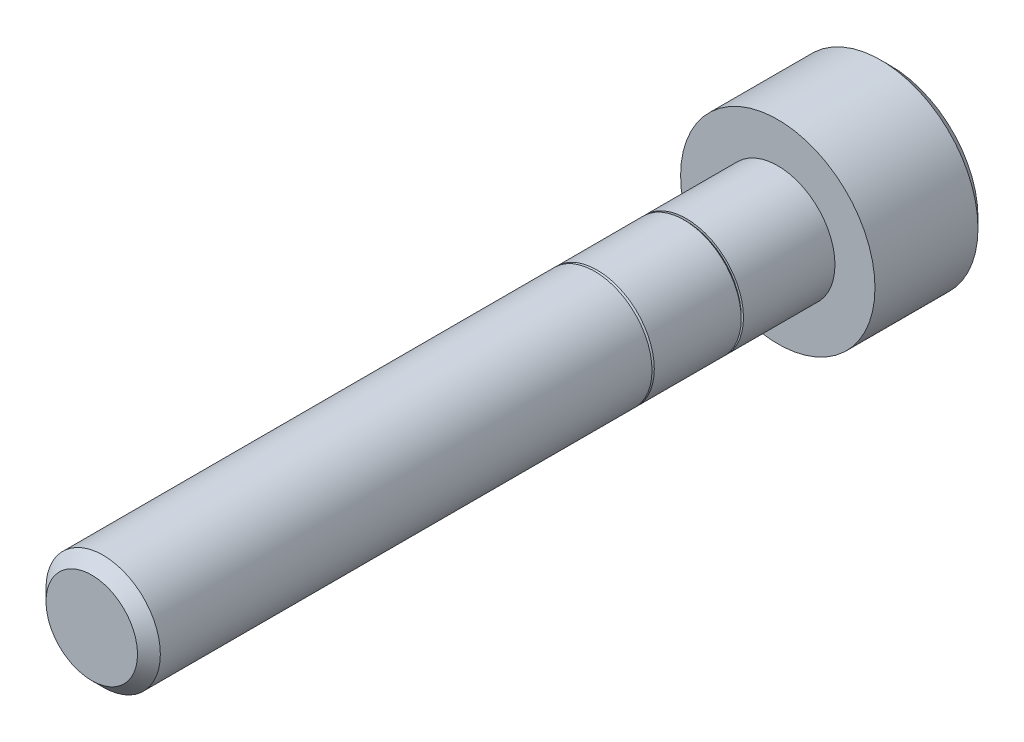
ISO-10303-21;
HEADER;
FILE_DESCRIPTION(('STEP AP214'),'2;1');
FILE_NAME('part.step','',(''),(''),'','','');
FILE_SCHEMA(('AUTOMOTIVE_DESIGN { 1 0 10303 214 1 1 1 1 }'));
ENDSEC;
DATA;
#1=APPLICATION_CONTEXT('core data for automotive mechanical design processes');
#2=APPLICATION_PROTOCOL_DEFINITION('international standard','automotive_design',2000,#1);
#3=PRODUCT_CONTEXT('',#1,'mechanical');
#4=PRODUCT('Part','Part','',(#3));
#5=PRODUCT_RELATED_PRODUCT_CATEGORY('part','',(#4));
#6=PRODUCT_DEFINITION_FORMATION('','',#4);
#7=PRODUCT_DEFINITION_CONTEXT('part definition',#1,'design');
#8=PRODUCT_DEFINITION('design','',#6,#7);
#9=PRODUCT_DEFINITION_SHAPE('','',#8);
#10=(LENGTH_UNIT() NAMED_UNIT(*) SI_UNIT(.MILLI.,.METRE.));
#11=(NAMED_UNIT(*) PLANE_ANGLE_UNIT() SI_UNIT($,.RADIAN.));
#12=(NAMED_UNIT(*) SI_UNIT($,.STERADIAN.) SOLID_ANGLE_UNIT());
#13=UNCERTAINTY_MEASURE_WITH_UNIT(LENGTH_MEASURE(1.E-05),#10,'distance_accuracy_value','');
#14=(GEOMETRIC_REPRESENTATION_CONTEXT(3) GLOBAL_UNCERTAINTY_ASSIGNED_CONTEXT((#13)) GLOBAL_UNIT_ASSIGNED_CONTEXT((#10,
#11,#12)) REPRESENTATION_CONTEXT('',''));
#15=CARTESIAN_POINT('',(0.,0.,0.));
#16=DIRECTION('',(0.,0.,1.));
#17=DIRECTION('',(1.,0.,0.));
#18=AXIS2_PLACEMENT_3D('',#15,#16,#17);
#19=CARTESIAN_POINT('',(0.,0.,-2.43));
#20=DIRECTION('',(0.,0.,1.));
#21=DIRECTION('',(1.,0.,0.));
#22=AXIS2_PLACEMENT_3D('',#19,#20,#21);
#23=PLANE('',#22);
#24=DIRECTION('',(-0.866025403784439,0.5,0.));
#25=VECTOR('',#24,1.);
#26=CARTESIAN_POINT('',(0.,2.3094010767585,-2.43));
#27=LINE('',#26,#25);
#28=CARTESIAN_POINT('',(0.,2.3094010767585,-2.43));
#29=VERTEX_POINT('',#28);
#30=CARTESIAN_POINT('',(2.,1.15470053837925,-2.43));
#31=VERTEX_POINT('',#30);
#32=EDGE_CURVE('E68',#29,#31,#27,.F.);
#33=ORIENTED_EDGE('',*,*,#32,.T.);
#34=DIRECTION('',(0.,1.,0.));
#35=VECTOR('',#34,1.);
#36=CARTESIAN_POINT('',(2.,1.15470053837925,-2.43));
#37=LINE('',#36,#35);
#38=CARTESIAN_POINT('',(2.,-1.15470053837925,-2.43));
#39=VERTEX_POINT('',#38);
#40=EDGE_CURVE('E91',#31,#39,#37,.F.);
#41=ORIENTED_EDGE('',*,*,#40,.T.);
#42=DIRECTION('',(0.866025403784439,0.499999999999999,0.));
#43=VECTOR('',#42,1.);
#44=CARTESIAN_POINT('',(2.,-1.15470053837925,-2.43));
#45=LINE('',#44,#43);
#46=CARTESIAN_POINT('',(0.,-2.3094010767585,-2.43));
#47=VERTEX_POINT('',#46);
#48=EDGE_CURVE('E145',#39,#47,#45,.F.);
#49=ORIENTED_EDGE('',*,*,#48,.T.);
#50=DIRECTION('',(0.866025403784438,-0.5,0.));
#51=VECTOR('',#50,1.);
#52=CARTESIAN_POINT('',(0.,-2.3094010767585,-2.43));
#53=LINE('',#52,#51);
#54=CARTESIAN_POINT('',(-2.,-1.15470053837925,-2.43));
#55=VERTEX_POINT('',#54);
#56=EDGE_CURVE('E140',#47,#55,#53,.F.);
#57=ORIENTED_EDGE('',*,*,#56,.T.);
#58=DIRECTION('',(0.,1.,0.));
#59=VECTOR('',#58,1.);
#60=CARTESIAN_POINT('',(-2.,-1.15470053837925,-2.43));
#61=LINE('',#60,#59);
#62=CARTESIAN_POINT('',(-2.,1.15470053837925,-2.43));
#63=VERTEX_POINT('',#62);
#64=EDGE_CURVE('E74',#55,#63,#61,.T.);
#65=ORIENTED_EDGE('',*,*,#64,.T.);
#66=DIRECTION('',(-0.866025403784439,-0.5,0.));
#67=VECTOR('',#66,1.);
#68=CARTESIAN_POINT('',(-2.,1.15470053837925,-2.43));
#69=LINE('',#68,#67);
#70=EDGE_CURVE('E71',#63,#29,#69,.F.);
#71=ORIENTED_EDGE('',*,*,#70,.T.);
#72=EDGE_LOOP('',(#33,#41,#49,#57,#65,#71));
#73=FACE_BOUND('',#72,.T.);
#74=ADVANCED_FACE('F17',(#73),#23,.F.);
#75=CARTESIAN_POINT('',(-2.,1.15470053837925,-4.93));
#76=DIRECTION('',(-0.5,0.866025403784439,0.));
#77=DIRECTION('',(-0.866025403784439,-0.5,0.));
#78=AXIS2_PLACEMENT_3D('',#75,#76,#77);
#79=PLANE('',#78);
#80=ORIENTED_EDGE('',*,*,#70,.F.);
#81=DIRECTION('',(0.,0.,1.));
#82=VECTOR('',#81,1.);
#83=CARTESIAN_POINT('',(-2.,1.15470053837925,-4.93));
#84=LINE('',#83,#82);
#85=CARTESIAN_POINT('',(-2.,1.15470053837925,-4.93));
#86=VERTEX_POINT('',#85);
#87=EDGE_CURVE('E135',#63,#86,#84,.F.);
#88=ORIENTED_EDGE('',*,*,#87,.T.);
#89=DIRECTION('',(0.866025403784439,0.499999999999999,0.));
#90=VECTOR('',#89,1.);
#91=CARTESIAN_POINT('',(-2.,1.15470053837925,-4.93));
#92=LINE('',#91,#90);
#93=CARTESIAN_POINT('',(0.,2.3094010767585,-4.93));
#94=VERTEX_POINT('',#93);
#95=EDGE_CURVE('E82',#86,#94,#92,.T.);
#96=ORIENTED_EDGE('',*,*,#95,.T.);
#97=DIRECTION('',(0.,0.,1.));
#98=VECTOR('',#97,1.);
#99=CARTESIAN_POINT('',(0.,2.3094010767585,-4.93));
#100=LINE('',#99,#98);
#101=EDGE_CURVE('E77',#94,#29,#100,.T.);
#102=ORIENTED_EDGE('',*,*,#101,.T.);
#103=EDGE_LOOP('',(#80,#88,#96,#102));
#104=FACE_BOUND('',#103,.T.);
#105=ADVANCED_FACE('F80',(#104),#79,.F.);
#106=CARTESIAN_POINT('',(0.,2.3094010767585,-4.93));
#107=DIRECTION('',(0.5,0.866025403784439,0.));
#108=DIRECTION('',(-0.866025403784439,0.5,0.));
#109=AXIS2_PLACEMENT_3D('',#106,#107,#108);
#110=PLANE('',#109);
#111=ORIENTED_EDGE('',*,*,#32,.F.);
#112=ORIENTED_EDGE('',*,*,#101,.F.);
#113=DIRECTION('',(0.866025403784439,-0.5,0.));
#114=VECTOR('',#113,1.);
#115=CARTESIAN_POINT('',(0.,2.3094010767585,-4.93));
#116=LINE('',#115,#114);
#117=CARTESIAN_POINT('',(2.,1.15470053837925,-4.93));
#118=VERTEX_POINT('',#117);
#119=EDGE_CURVE('E132',#94,#118,#116,.T.);
#120=ORIENTED_EDGE('',*,*,#119,.T.);
#121=DIRECTION('',(0.,0.,-1.));
#122=VECTOR('',#121,1.);
#123=CARTESIAN_POINT('',(2.,1.15470053837925,-4.93));
#124=LINE('',#123,#122);
#125=EDGE_CURVE('E88',#118,#31,#124,.F.);
#126=ORIENTED_EDGE('',*,*,#125,.T.);
#127=EDGE_LOOP('',(#111,#112,#120,#126));
#128=FACE_BOUND('',#127,.T.);
#129=ADVANCED_FACE('F86',(#128),#110,.F.);
#130=CARTESIAN_POINT('',(2.,1.15470053837925,-4.93));
#131=DIRECTION('',(1.,0.,0.));
#132=DIRECTION('',(0.,0.,-1.));
#133=AXIS2_PLACEMENT_3D('',#130,#131,#132);
#134=PLANE('',#133);
#135=ORIENTED_EDGE('',*,*,#40,.F.);
#136=ORIENTED_EDGE('',*,*,#125,.F.);
#137=DIRECTION('',(0.,1.,0.));
#138=VECTOR('',#137,1.);
#139=CARTESIAN_POINT('',(2.,0.,-4.93));
#140=LINE('',#139,#138);
#141=CARTESIAN_POINT('',(2.,-1.15470053837925,-4.93));
#142=VERTEX_POINT('',#141);
#143=EDGE_CURVE('E130',#118,#142,#140,.F.);
#144=ORIENTED_EDGE('',*,*,#143,.T.);
#145=DIRECTION('',(0.,0.,1.));
#146=VECTOR('',#145,1.);
#147=CARTESIAN_POINT('',(2.,-1.15470053837925,-4.93));
#148=LINE('',#147,#146);
#149=EDGE_CURVE('E147',#142,#39,#148,.T.);
#150=ORIENTED_EDGE('',*,*,#149,.T.);
#151=EDGE_LOOP('',(#135,#136,#144,#150));
#152=FACE_BOUND('',#151,.T.);
#153=ADVANCED_FACE('F152',(#152),#134,.F.);
#154=CARTESIAN_POINT('',(2.,-1.15470053837925,-4.93));
#155=DIRECTION('',(0.499999999999999,-0.866025403784439,0.));
#156=DIRECTION('',(0.866025403784439,0.499999999999999,0.));
#157=AXIS2_PLACEMENT_3D('',#154,#155,#156);
#158=PLANE('',#157);
#159=ORIENTED_EDGE('',*,*,#48,.F.);
#160=ORIENTED_EDGE('',*,*,#149,.F.);
#161=DIRECTION('',(-0.866025403784439,-0.499999999999999,0.));
#162=VECTOR('',#161,1.);
#163=CARTESIAN_POINT('',(2.,-1.15470053837925,-4.93));
#164=LINE('',#163,#162);
#165=CARTESIAN_POINT('',(0.,-2.3094010767585,-4.93));
#166=VERTEX_POINT('',#165);
#167=EDGE_CURVE('E128',#142,#166,#164,.T.);
#168=ORIENTED_EDGE('',*,*,#167,.T.);
#169=DIRECTION('',(0.,0.,1.));
#170=VECTOR('',#169,1.);
#171=CARTESIAN_POINT('',(0.,-2.3094010767585,-4.93));
#172=LINE('',#171,#170);
#173=EDGE_CURVE('E142',#166,#47,#172,.T.);
#174=ORIENTED_EDGE('',*,*,#173,.T.);
#175=EDGE_LOOP('',(#159,#160,#168,#174));
#176=FACE_BOUND('',#175,.T.);
#177=ADVANCED_FACE('F156',(#176),#158,.F.);
#178=CARTESIAN_POINT('',(0.,-2.3094010767585,-4.93));
#179=DIRECTION('',(-0.5,-0.866025403784438,0.));
#180=DIRECTION('',(0.866025403784438,-0.5,0.));
#181=AXIS2_PLACEMENT_3D('',#178,#179,#180);
#182=PLANE('',#181);
#183=ORIENTED_EDGE('',*,*,#56,.F.);
#184=ORIENTED_EDGE('',*,*,#173,.F.);
#185=DIRECTION('',(-0.866025403784439,0.5,0.));
#186=VECTOR('',#185,1.);
#187=CARTESIAN_POINT('',(0.,-2.3094010767585,-4.93));
#188=LINE('',#187,#186);
#189=CARTESIAN_POINT('',(-2.,-1.15470053837925,-4.93));
#190=VERTEX_POINT('',#189);
#191=EDGE_CURVE('E35',#166,#190,#188,.T.);
#192=ORIENTED_EDGE('',*,*,#191,.T.);
#193=DIRECTION('',(0.,0.,1.));
#194=VECTOR('',#193,1.);
#195=CARTESIAN_POINT('',(-2.,-1.15470053837925,-4.93));
#196=LINE('',#195,#194);
#197=EDGE_CURVE('E138',#190,#55,#196,.T.);
#198=ORIENTED_EDGE('',*,*,#197,.T.);
#199=EDGE_LOOP('',(#183,#184,#192,#198));
#200=FACE_BOUND('',#199,.T.);
#201=ADVANCED_FACE('F158',(#200),#182,.F.);
#202=CARTESIAN_POINT('',(-2.,-1.15470053837925,-4.93));
#203=DIRECTION('',(-1.,0.,0.));
#204=DIRECTION('',(0.,0.,1.));
#205=AXIS2_PLACEMENT_3D('',#202,#203,#204);
#206=PLANE('',#205);
#207=ORIENTED_EDGE('',*,*,#64,.F.);
#208=ORIENTED_EDGE('',*,*,#197,.F.);
#209=DIRECTION('',(0.,1.,0.));
#210=VECTOR('',#209,1.);
#211=CARTESIAN_POINT('',(-2.,0.,-4.93));
#212=LINE('',#211,#210);
#213=EDGE_CURVE('E121',#190,#86,#212,.T.);
#214=ORIENTED_EDGE('',*,*,#213,.T.);
#215=ORIENTED_EDGE('',*,*,#87,.F.);
#216=EDGE_LOOP('',(#207,#208,#214,#215));
#217=FACE_BOUND('',#216,.T.);
#218=ADVANCED_FACE('F161',(#217),#206,.F.);
#219=CARTESIAN_POINT('',(0.,0.,-4.93));
#220=DIRECTION('',(0.,0.,1.));
#221=DIRECTION('',(1.,0.,0.));
#222=AXIS2_PLACEMENT_3D('',#219,#220,#221);
#223=PLANE('',#222);
#224=ORIENTED_EDGE('',*,*,#191,.F.);
#225=ORIENTED_EDGE('',*,*,#167,.F.);
#226=ORIENTED_EDGE('',*,*,#143,.F.);
#227=ORIENTED_EDGE('',*,*,#119,.F.);
#228=ORIENTED_EDGE('',*,*,#95,.F.);
#229=ORIENTED_EDGE('',*,*,#213,.F.);
#230=EDGE_LOOP('',(#224,#225,#226,#227,#228,#229));
#231=FACE_BOUND('',#230,.T.);
#232=CARTESIAN_POINT('',(0.,0.,-4.9300000000585));
#233=DIRECTION('',(0.,0.,1.));
#234=DIRECTION('',(1.,0.,0.));
#235=AXIS2_PLACEMENT_3D('',#232,#233,#234);
#236=CIRCLE('',#235,3.82500000000618);
#237=CARTESIAN_POINT('',(3.82500000000618,0.,-4.9300000000585));
#238=VERTEX_POINT('',#237);
#239=EDGE_CURVE('E20',#238,#238,#236,.T.);
#240=ORIENTED_EDGE('',*,*,#239,.F.);
#241=EDGE_LOOP('',(#240));
#242=FACE_BOUND('',#241,.T.);
#243=ADVANCED_FACE('F163',(#231,#242),#223,.F.);
#244=CARTESIAN_POINT('',(0.,0.,-4.50499999999465));
#245=DIRECTION('',(0.,0.,1.));
#246=DIRECTION('',(1.,0.,0.));
#247=AXIS2_PLACEMENT_3D('',#244,#245,#246);
#248=CONICAL_SURFACE('',#247,4.25000000007003,0.785398163397448);
#249=ORIENTED_EDGE('',*,*,#239,.T.);
#250=EDGE_LOOP('',(#249));
#251=FACE_BOUND('',#250,.T.);
#252=CARTESIAN_POINT('',(0.,0.,-4.505));
#253=DIRECTION('',(0.,0.,1.));
#254=DIRECTION('',(1.,0.,0.));
#255=AXIS2_PLACEMENT_3D('',#252,#253,#254);
#256=CIRCLE('',#255,4.25);
#257=CARTESIAN_POINT('',(4.25,0.,-4.505));
#258=VERTEX_POINT('',#257);
#259=EDGE_CURVE('E113',#258,#258,#256,.T.);
#260=ORIENTED_EDGE('',*,*,#259,.F.);
#261=EDGE_LOOP('',(#260));
#262=FACE_BOUND('',#261,.T.);
#263=ADVANCED_FACE('F166',(#251,#262),#248,.T.);
#264=CARTESIAN_POINT('',(0.,0.,-4.93));
#265=DIRECTION('',(0.,0.,1.));
#266=DIRECTION('',(1.,0.,0.));
#267=AXIS2_PLACEMENT_3D('',#264,#265,#266);
#268=CYLINDRICAL_SURFACE('',#267,4.25);
#269=ORIENTED_EDGE('',*,*,#259,.T.);
#270=EDGE_LOOP('',(#269));
#271=FACE_BOUND('',#270,.T.);
#272=CARTESIAN_POINT('',(0.,0.,0.));
#273=DIRECTION('',(0.,0.,1.));
#274=DIRECTION('',(1.,0.,0.));
#275=AXIS2_PLACEMENT_3D('',#272,#273,#274);
#276=CIRCLE('',#275,4.25);
#277=CARTESIAN_POINT('',(4.25,0.,0.));
#278=VERTEX_POINT('',#277);
#279=EDGE_CURVE('E111',#278,#278,#276,.T.);
#280=ORIENTED_EDGE('',*,*,#279,.F.);
#281=EDGE_LOOP('',(#280));
#282=FACE_BOUND('',#281,.T.);
#283=ADVANCED_FACE('F172',(#271,#282),#268,.T.);
#284=CARTESIAN_POINT('',(0.,0.,0.));
#285=DIRECTION('',(0.,0.,1.));
#286=DIRECTION('',(1.,0.,0.));
#287=AXIS2_PLACEMENT_3D('',#284,#285,#286);
#288=PLANE('',#287);
#289=CARTESIAN_POINT('',(0.,0.,0.));
#290=DIRECTION('',(0.,0.,1.));
#291=DIRECTION('',(1.,0.,0.));
#292=AXIS2_PLACEMENT_3D('',#289,#290,#291);
#293=CIRCLE('',#292,2.5);
#294=CARTESIAN_POINT('',(2.5,0.,0.));
#295=VERTEX_POINT('',#294);
#296=EDGE_CURVE('E109',#295,#295,#293,.T.);
#297=ORIENTED_EDGE('',*,*,#296,.F.);
#298=EDGE_LOOP('',(#297));
#299=FACE_BOUND('',#298,.T.);
#300=ORIENTED_EDGE('',*,*,#279,.T.);
#301=EDGE_LOOP('',(#300));
#302=FACE_BOUND('',#301,.T.);
#303=ADVANCED_FACE('F178',(#299,#302),#288,.T.);
#304=CARTESIAN_POINT('',(0.,0.,0.));
#305=DIRECTION('',(0.,0.,1.));
#306=DIRECTION('',(1.,0.,0.));
#307=AXIS2_PLACEMENT_3D('',#304,#305,#306);
#308=CYLINDRICAL_SURFACE('',#307,2.5);
#309=ORIENTED_EDGE('',*,*,#296,.T.);
#310=EDGE_LOOP('',(#309));
#311=FACE_BOUND('',#310,.T.);
#312=CARTESIAN_POINT('',(0.,0.,4.));
#313=DIRECTION('',(0.,0.,1.));
#314=DIRECTION('',(1.,0.,0.));
#315=AXIS2_PLACEMENT_3D('',#312,#313,#314);
#316=CIRCLE('',#315,2.5);
#317=CARTESIAN_POINT('',(2.5,0.,4.));
#318=VERTEX_POINT('',#317);
#319=EDGE_CURVE('E106',#318,#318,#316,.T.);
#320=ORIENTED_EDGE('',*,*,#319,.F.);
#321=EDGE_LOOP('',(#320));
#322=FACE_BOUND('',#321,.T.);
#323=ADVANCED_FACE('F215',(#311,#322),#308,.T.);
#324=CARTESIAN_POINT('',(0.,0.,4.));
#325=DIRECTION('',(0.,0.,1.));
#326=DIRECTION('',(1.,0.,0.));
#327=AXIS2_PLACEMENT_3D('',#324,#325,#326);
#328=PLANE('',#327);
#329=CARTESIAN_POINT('',(0.,0.,3.99999999996226));
#330=DIRECTION('',(0.,0.,1.));
#331=DIRECTION('',(1.,0.,0.));
#332=AXIS2_PLACEMENT_3D('',#329,#330,#331);
#333=CIRCLE('',#332,2.39999999996598);
#334=CARTESIAN_POINT('',(2.39999999996598,0.,3.99999999996226));
#335=VERTEX_POINT('',#334);
#336=EDGE_CURVE('E102',#335,#335,#333,.T.);
#337=ORIENTED_EDGE('',*,*,#336,.F.);
#338=EDGE_LOOP('',(#337));
#339=FACE_BOUND('',#338,.T.);
#340=ORIENTED_EDGE('',*,*,#319,.T.);
#341=EDGE_LOOP('',(#340));
#342=FACE_BOUND('',#341,.T.);
#343=ADVANCED_FACE('F211',(#339,#342),#328,.T.);
#344=CARTESIAN_POINT('',(0.,0.,4.09999999993715));
#345=DIRECTION('',(0.,0.,1.));
#346=DIRECTION('',(1.,0.,0.));
#347=AXIS2_PLACEMENT_3D('',#344,#345,#346);
#348=CONICAL_SURFACE('',#347,2.49999999994088,0.785398163397448);
#349=ORIENTED_EDGE('',*,*,#336,.T.);
#350=EDGE_LOOP('',(#349));
#351=FACE_BOUND('',#350,.T.);
#352=CARTESIAN_POINT('',(0.,0.,4.1));
#353=DIRECTION('',(0.,0.,1.));
#354=DIRECTION('',(1.,0.,0.));
#355=AXIS2_PLACEMENT_3D('',#352,#353,#354);
#356=CIRCLE('',#355,2.5);
#357=CARTESIAN_POINT('',(2.5,0.,4.1));
#358=VERTEX_POINT('',#357);
#359=EDGE_CURVE('E105',#358,#358,#356,.T.);
#360=ORIENTED_EDGE('',*,*,#359,.F.);
#361=EDGE_LOOP('',(#360));
#362=FACE_BOUND('',#361,.T.);
#363=ADVANCED_FACE('F207',(#351,#362),#348,.T.);
#364=CARTESIAN_POINT('',(0.,0.,4.));
#365=DIRECTION('',(0.,0.,1.));
#366=DIRECTION('',(1.,0.,0.));
#367=AXIS2_PLACEMENT_3D('',#364,#365,#366);
#368=CYLINDRICAL_SURFACE('',#367,2.5);
#369=ORIENTED_EDGE('',*,*,#359,.T.);
#370=EDGE_LOOP('',(#369));
#371=FACE_BOUND('',#370,.T.);
#372=CARTESIAN_POINT('',(0.,0.,7.90000000000646));
#373=DIRECTION('',(0.,0.,-1.));
#374=DIRECTION('',(-1.,0.,0.));
#375=AXIS2_PLACEMENT_3D('',#372,#373,#374);
#376=CIRCLE('',#375,2.49999999999773);
#377=CARTESIAN_POINT('',(-2.49999999999773,0.,7.90000000000646));
#378=VERTEX_POINT('',#377);
#379=EDGE_CURVE('E101',#378,#378,#376,.F.);
#380=ORIENTED_EDGE('',*,*,#379,.F.);
#381=EDGE_LOOP('',(#380));
#382=FACE_BOUND('',#381,.T.);
#383=ADVANCED_FACE('F203',(#371,#382),#368,.T.);
#384=CARTESIAN_POINT('',(0.,0.,30.));
#385=DIRECTION('',(0.,0.,1.));
#386=DIRECTION('',(1.,0.,0.));
#387=AXIS2_PLACEMENT_3D('',#384,#385,#386);
#388=PLANE('',#387);
#389=CARTESIAN_POINT('',(0.,0.,29.9999999999727));
#390=DIRECTION('',(0.,0.,-1.));
#391=DIRECTION('',(-1.,0.,0.));
#392=AXIS2_PLACEMENT_3D('',#389,#390,#391);
#393=CIRCLE('',#392,1.99999999995271);
#394=CARTESIAN_POINT('',(-1.99999999995271,0.,29.9999999999727));
#395=VERTEX_POINT('',#394);
#396=EDGE_CURVE('E98',#395,#395,#393,.T.);
#397=ORIENTED_EDGE('',*,*,#396,.F.);
#398=EDGE_LOOP('',(#397));
#399=FACE_BOUND('',#398,.T.);
#400=ADVANCED_FACE('F199',(#399),#388,.T.);
#401=CARTESIAN_POINT('',(0.,0.,7.90000000000646));
#402=DIRECTION('',(0.,0.,-1.));
#403=DIRECTION('',(-1.,0.,0.));
#404=AXIS2_PLACEMENT_3D('',#401,#402,#403);
#405=CONICAL_SURFACE('',#404,2.49999999999773,0.785398163681665);
#406=ORIENTED_EDGE('',*,*,#379,.T.);
#407=EDGE_LOOP('',(#406));
#408=FACE_BOUND('',#407,.T.);
#409=CARTESIAN_POINT('',(0.,0.,7.99999999998136));
#410=DIRECTION('',(0.,0.,-1.));
#411=DIRECTION('',(-1.,0.,0.));
#412=AXIS2_PLACEMENT_3D('',#409,#410,#411);
#413=CIRCLE('',#412,2.39999999996598);
#414=CARTESIAN_POINT('',(-2.39999999996598,0.,7.99999999998136));
#415=VERTEX_POINT('',#414);
#416=EDGE_CURVE('E95',#415,#415,#413,.T.);
#417=ORIENTED_EDGE('',*,*,#416,.T.);
#418=EDGE_LOOP('',(#417));
#419=FACE_BOUND('',#418,.T.);
#420=ADVANCED_FACE('F195',(#408,#419),#405,.T.);
#421=CARTESIAN_POINT('',(0.,0.,29.4999999998709));
#422=DIRECTION('',(0.,0.,-1.));
#423=DIRECTION('',(-1.,0.,0.));
#424=AXIS2_PLACEMENT_3D('',#421,#422,#423);
#425=CONICAL_SURFACE('',#424,2.50000000005457,0.785398163397448);
#426=CARTESIAN_POINT('',(0.,0.,29.5));
#427=DIRECTION('',(0.,0.,1.));
#428=DIRECTION('',(1.,0.,0.));
#429=AXIS2_PLACEMENT_3D('',#426,#427,#428);
#430=CIRCLE('',#429,2.5);
#431=CARTESIAN_POINT('',(2.5,0.,29.5));
#432=VERTEX_POINT('',#431);
#433=EDGE_CURVE('E26',#432,#432,#430,.F.);
#434=ORIENTED_EDGE('',*,*,#433,.F.);
#435=EDGE_LOOP('',(#434));
#436=FACE_BOUND('',#435,.T.);
#437=ORIENTED_EDGE('',*,*,#396,.T.);
#438=EDGE_LOOP('',(#437));
#439=FACE_BOUND('',#438,.T.);
#440=ADVANCED_FACE('F188',(#436,#439),#425,.T.);
#441=CARTESIAN_POINT('',(0.,0.,8.));
#442=DIRECTION('',(0.,0.,1.));
#443=DIRECTION('',(1.,0.,0.));
#444=AXIS2_PLACEMENT_3D('',#441,#442,#443);
#445=PLANE('',#444);
#446=ORIENTED_EDGE('',*,*,#416,.F.);
#447=EDGE_LOOP('',(#446));
#448=FACE_BOUND('',#447,.T.);
#449=CARTESIAN_POINT('',(0.,0.,8.));
#450=DIRECTION('',(0.,0.,1.));
#451=DIRECTION('',(1.,0.,0.));
#452=AXIS2_PLACEMENT_3D('',#449,#450,#451);
#453=CIRCLE('',#452,2.5);
#454=CARTESIAN_POINT('',(2.5,0.,8.));
#455=VERTEX_POINT('',#454);
#456=EDGE_CURVE('E11',#455,#455,#453,.T.);
#457=ORIENTED_EDGE('',*,*,#456,.F.);
#458=EDGE_LOOP('',(#457));
#459=FACE_BOUND('',#458,.T.);
#460=ADVANCED_FACE('F182',(#448,#459),#445,.F.);
#461=CARTESIAN_POINT('',(0.,0.,8.));
#462=DIRECTION('',(0.,0.,1.));
#463=DIRECTION('',(1.,0.,0.));
#464=AXIS2_PLACEMENT_3D('',#461,#462,#463);
#465=CYLINDRICAL_SURFACE('',#464,2.5);
#466=ORIENTED_EDGE('',*,*,#456,.T.);
#467=EDGE_LOOP('',(#466));
#468=FACE_BOUND('',#467,.T.);
#469=ORIENTED_EDGE('',*,*,#433,.T.);
#470=EDGE_LOOP('',(#469));
#471=FACE_BOUND('',#470,.T.);
#472=ADVANCED_FACE('F180',(#468,#471),#465,.T.);
#473=CLOSED_SHELL('',(#74,#105,#129,#153,#177,#201,#218,#243,#263,#283,#303,#323,#343,#363,#383,
#400,#420,#440,#460,#472));
#474=MANIFOLD_SOLID_BREP('B1',#473);
#475=ADVANCED_BREP_SHAPE_REPRESENTATION('',(#18,#474),#14);
#476=SHAPE_DEFINITION_REPRESENTATION(#9,#475);
ENDSEC;
END-ISO-10303-21;
